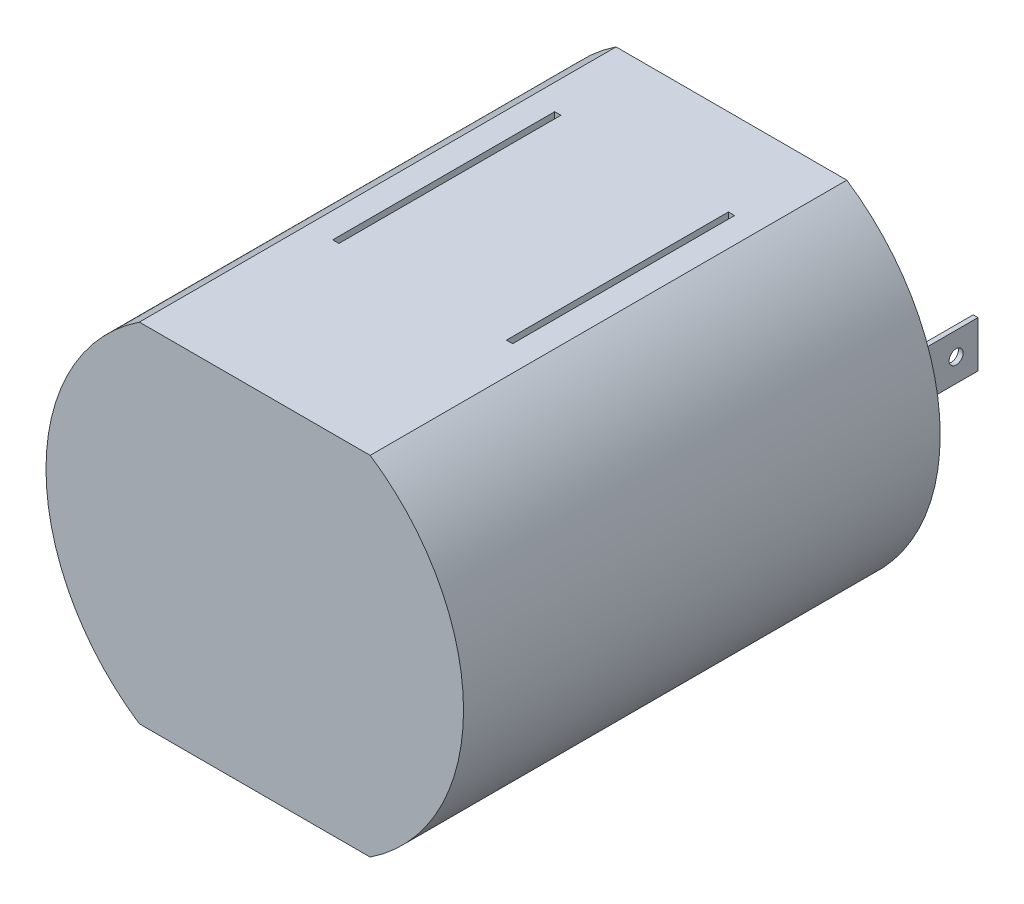
ISO-10303-21;
HEADER;
FILE_DESCRIPTION(('STEP AP214'),'2;1');
FILE_NAME('part.step','',(''),(''),'','','');
FILE_SCHEMA(('AUTOMOTIVE_DESIGN { 1 0 10303 214 1 1 1 1 }'));
ENDSEC;
DATA;
#1=APPLICATION_CONTEXT('core data for automotive mechanical design processes');
#2=APPLICATION_PROTOCOL_DEFINITION('international standard','automotive_design',2000,#1);
#3=PRODUCT_CONTEXT('',#1,'mechanical');
#4=PRODUCT('Part','Part','',(#3));
#5=PRODUCT_RELATED_PRODUCT_CATEGORY('part','',(#4));
#6=PRODUCT_DEFINITION_FORMATION('','',#4);
#7=PRODUCT_DEFINITION_CONTEXT('part definition',#1,'design');
#8=PRODUCT_DEFINITION('design','',#6,#7);
#9=PRODUCT_DEFINITION_SHAPE('','',#8);
#10=(LENGTH_UNIT() NAMED_UNIT(*) SI_UNIT(.MILLI.,.METRE.));
#11=(NAMED_UNIT(*) PLANE_ANGLE_UNIT() SI_UNIT($,.RADIAN.));
#12=(NAMED_UNIT(*) SI_UNIT($,.STERADIAN.) SOLID_ANGLE_UNIT());
#13=UNCERTAINTY_MEASURE_WITH_UNIT(LENGTH_MEASURE(1.E-05),#10,'distance_accuracy_value','');
#14=(GEOMETRIC_REPRESENTATION_CONTEXT(3) GLOBAL_UNCERTAINTY_ASSIGNED_CONTEXT((#13)) GLOBAL_UNIT_ASSIGNED_CONTEXT((#10,
#11,#12)) REPRESENTATION_CONTEXT('',''));
#15=CARTESIAN_POINT('',(0.,0.,0.));
#16=DIRECTION('',(0.,0.,1.));
#17=DIRECTION('',(1.,0.,0.));
#18=AXIS2_PLACEMENT_3D('',#15,#16,#17);
#19=CARTESIAN_POINT('',(0.,0.,0.));
#20=DIRECTION('',(0.,0.,1.));
#21=DIRECTION('',(1.,0.,0.));
#22=AXIS2_PLACEMENT_3D('',#19,#20,#21);
#23=PLANE('',#22);
#24=DIRECTION('',(0.,1.,0.));
#25=VECTOR('',#24,1.);
#26=CARTESIAN_POINT('',(-4.28659431064549,-0.664589732982446,0.));
#27=LINE('',#26,#25);
#28=CARTESIAN_POINT('',(-4.28659431064549,-0.664589732982446,0.));
#29=VERTEX_POINT('',#28);
#30=CARTESIAN_POINT('',(-4.28659431064549,0.664589732982446,0.));
#31=VERTEX_POINT('',#30);
#32=EDGE_CURVE('E193',#29,#31,#27,.T.);
#33=ORIENTED_EDGE('',*,*,#32,.F.);
#34=DIRECTION('',(-1.,0.,0.));
#35=VECTOR('',#34,1.);
#36=CARTESIAN_POINT('',(-4.28659431064549,-0.664589732982446,0.));
#37=LINE('',#36,#35);
#38=CARTESIAN_POINT('',(-4.14845641783212,-0.664589732982446,0.));
#39=VERTEX_POINT('',#38);
#40=EDGE_CURVE('E206',#39,#29,#37,.T.);
#41=ORIENTED_EDGE('',*,*,#40,.F.);
#42=DIRECTION('',(0.,-1.,0.));
#43=VECTOR('',#42,1.);
#44=CARTESIAN_POINT('',(-4.14845641783212,-0.664589732982446,0.));
#45=LINE('',#44,#43);
#46=CARTESIAN_POINT('',(-4.14845641783212,0.664589732982446,0.));
#47=VERTEX_POINT('',#46);
#48=EDGE_CURVE('E215',#47,#39,#45,.T.);
#49=ORIENTED_EDGE('',*,*,#48,.F.);
#50=DIRECTION('',(1.,0.,0.));
#51=VECTOR('',#50,1.);
#52=CARTESIAN_POINT('',(-4.28659431064549,0.664589732982446,0.));
#53=LINE('',#52,#51);
#54=EDGE_CURVE('E196',#31,#47,#53,.T.);
#55=ORIENTED_EDGE('',*,*,#54,.F.);
#56=EDGE_LOOP('',(#33,#41,#49,#55));
#57=FACE_BOUND('',#56,.T.);
#58=CARTESIAN_POINT('',(0.,0.,0.));
#59=DIRECTION('',(0.,0.,1.));
#60=DIRECTION('',(1.,0.,0.));
#61=AXIS2_PLACEMENT_3D('',#58,#59,#60);
#62=CIRCLE('',#61,6.);
#63=CARTESIAN_POINT('',(3.3166247903554,-5.,0.));
#64=VERTEX_POINT('',#63);
#65=CARTESIAN_POINT('',(3.3166247903554,5.,0.));
#66=VERTEX_POINT('',#65);
#67=EDGE_CURVE('E292',#64,#66,#62,.T.);
#68=ORIENTED_EDGE('',*,*,#67,.F.);
#69=DIRECTION('',(1.,0.,0.));
#70=VECTOR('',#69,1.);
#71=CARTESIAN_POINT('',(-3.3166247903554,-5.,0.));
#72=LINE('',#71,#70);
#73=CARTESIAN_POINT('',(-3.3166247903554,-5.,0.));
#74=VERTEX_POINT('',#73);
#75=EDGE_CURVE('E303',#74,#64,#72,.T.);
#76=ORIENTED_EDGE('',*,*,#75,.F.);
#77=CARTESIAN_POINT('',(0.,0.,0.));
#78=DIRECTION('',(0.,0.,1.));
#79=DIRECTION('',(1.,0.,0.));
#80=AXIS2_PLACEMENT_3D('',#77,#78,#79);
#81=CIRCLE('',#80,6.);
#82=CARTESIAN_POINT('',(-3.3166247903554,5.,0.));
#83=VERTEX_POINT('',#82);
#84=EDGE_CURVE('E314',#83,#74,#81,.T.);
#85=ORIENTED_EDGE('',*,*,#84,.F.);
#86=DIRECTION('',(-1.,0.,0.));
#87=VECTOR('',#86,1.);
#88=CARTESIAN_POINT('',(-3.3166247903554,5.,0.));
#89=LINE('',#88,#87);
#90=EDGE_CURVE('E312',#66,#83,#89,.T.);
#91=ORIENTED_EDGE('',*,*,#90,.F.);
#92=EDGE_LOOP('',(#68,#76,#85,#91));
#93=FACE_BOUND('',#92,.T.);
#94=CARTESIAN_POINT('',(0.,0.,0.));
#95=DIRECTION('',(0.,0.,1.));
#96=DIRECTION('',(1.,0.,0.));
#97=AXIS2_PLACEMENT_3D('',#94,#95,#96);
#98=CIRCLE('',#97,0.85);
#99=CARTESIAN_POINT('',(0.85,0.,0.));
#100=VERTEX_POINT('',#99);
#101=EDGE_CURVE('E11',#100,#100,#98,.F.);
#102=ORIENTED_EDGE('',*,*,#101,.F.);
#103=EDGE_LOOP('',(#102));
#104=FACE_BOUND('',#103,.T.);
#105=DIRECTION('',(0.,1.,0.));
#106=VECTOR('',#105,1.);
#107=CARTESIAN_POINT('',(4.14845641783212,-0.664589732982446,0.));
#108=LINE('',#107,#106);
#109=CARTESIAN_POINT('',(4.14845641783212,-0.664589732982446,0.));
#110=VERTEX_POINT('',#109);
#111=CARTESIAN_POINT('',(4.14845641783212,0.664589732982446,0.));
#112=VERTEX_POINT('',#111);
#113=EDGE_CURVE('E192',#110,#112,#108,.T.);
#114=ORIENTED_EDGE('',*,*,#113,.F.);
#115=DIRECTION('',(-1.,0.,0.));
#116=VECTOR('',#115,1.);
#117=CARTESIAN_POINT('',(4.28659431064549,-0.664589732982446,0.));
#118=LINE('',#117,#116);
#119=CARTESIAN_POINT('',(4.28659431064549,-0.664589732982446,0.));
#120=VERTEX_POINT('',#119);
#121=EDGE_CURVE('E189',#120,#110,#118,.T.);
#122=ORIENTED_EDGE('',*,*,#121,.F.);
#123=DIRECTION('',(0.,-1.,0.));
#124=VECTOR('',#123,1.);
#125=CARTESIAN_POINT('',(4.28659431064549,-0.664589732982446,0.));
#126=LINE('',#125,#124);
#127=CARTESIAN_POINT('',(4.28659431064549,0.664589732982446,0.));
#128=VERTEX_POINT('',#127);
#129=EDGE_CURVE('E55',#128,#120,#126,.T.);
#130=ORIENTED_EDGE('',*,*,#129,.F.);
#131=DIRECTION('',(1.,0.,0.));
#132=VECTOR('',#131,1.);
#133=CARTESIAN_POINT('',(4.28659431064549,0.664589732982446,0.));
#134=LINE('',#133,#132);
#135=EDGE_CURVE('E50',#112,#128,#134,.T.);
#136=ORIENTED_EDGE('',*,*,#135,.F.);
#137=EDGE_LOOP('',(#114,#122,#130,#136));
#138=FACE_BOUND('',#137,.T.);
#139=ADVANCED_FACE('F34',(#57,#93,#104,#138),#23,.F.);
#140=CARTESIAN_POINT('',(0.,0.,13.7));
#141=DIRECTION('',(0.,0.,-1.));
#142=DIRECTION('',(-1.,0.,0.));
#143=AXIS2_PLACEMENT_3D('',#140,#141,#142);
#144=CYLINDRICAL_SURFACE('',#143,6.);
#145=ORIENTED_EDGE('',*,*,#67,.T.);
#146=DIRECTION('',(0.,0.,-1.));
#147=VECTOR('',#146,1.);
#148=CARTESIAN_POINT('',(3.3166247903554,5.,13.7));
#149=LINE('',#148,#147);
#150=CARTESIAN_POINT('',(3.3166247903554,5.,13.7));
#151=VERTEX_POINT('',#150);
#152=EDGE_CURVE('E43',#151,#66,#149,.T.);
#153=ORIENTED_EDGE('',*,*,#152,.F.);
#154=CARTESIAN_POINT('',(0.,0.,13.7));
#155=DIRECTION('',(0.,0.,1.));
#156=DIRECTION('',(1.,0.,0.));
#157=AXIS2_PLACEMENT_3D('',#154,#155,#156);
#158=CIRCLE('',#157,6.);
#159=CARTESIAN_POINT('',(3.3166247903554,-5.,13.7));
#160=VERTEX_POINT('',#159);
#161=EDGE_CURVE('E299',#160,#151,#158,.T.);
#162=ORIENTED_EDGE('',*,*,#161,.F.);
#163=DIRECTION('',(0.,0.,-1.));
#164=VECTOR('',#163,1.);
#165=CARTESIAN_POINT('',(3.3166247903554,-5.,13.7));
#166=LINE('',#165,#164);
#167=EDGE_CURVE('E309',#160,#64,#166,.T.);
#168=ORIENTED_EDGE('',*,*,#167,.T.);
#169=EDGE_LOOP('',(#145,#153,#162,#168));
#170=FACE_BOUND('',#169,.T.);
#171=ADVANCED_FACE('F36',(#170),#144,.T.);
#172=CARTESIAN_POINT('',(-3.3166247903554,5.,13.7));
#173=DIRECTION('',(0.,-1.,0.));
#174=DIRECTION('',(0.,0.,-1.));
#175=AXIS2_PLACEMENT_3D('',#172,#173,#174);
#176=PLANE('',#175);
#177=DIRECTION('',(-1.,0.,0.));
#178=VECTOR('',#177,1.);
#179=CARTESIAN_POINT('',(2.58524337144905,5.,2.49401252835213));
#180=LINE('',#179,#178);
#181=CARTESIAN_POINT('',(2.58524337144905,5.,2.49401252835213));
#182=VERTEX_POINT('',#181);
#183=CARTESIAN_POINT('',(2.40667169885356,5.,2.49401252835213));
#184=VERTEX_POINT('',#183);
#185=EDGE_CURVE('E250',#182,#184,#180,.T.);
#186=ORIENTED_EDGE('',*,*,#185,.F.);
#187=DIRECTION('',(0.,0.,-1.));
#188=VECTOR('',#187,1.);
#189=CARTESIAN_POINT('',(2.58524337144905,5.,2.49401252835213));
#190=LINE('',#189,#188);
#191=CARTESIAN_POINT('',(2.58524337144905,5.,8.87492962219482));
#192=VERTEX_POINT('',#191);
#193=EDGE_CURVE('E234',#192,#182,#190,.T.);
#194=ORIENTED_EDGE('',*,*,#193,.F.);
#195=DIRECTION('',(1.,0.,0.));
#196=VECTOR('',#195,1.);
#197=CARTESIAN_POINT('',(2.58524337144905,5.,8.87492962219482));
#198=LINE('',#197,#196);
#199=CARTESIAN_POINT('',(2.40667169885356,5.,8.87492962219482));
#200=VERTEX_POINT('',#199);
#201=EDGE_CURVE('E239',#200,#192,#198,.T.);
#202=ORIENTED_EDGE('',*,*,#201,.F.);
#203=DIRECTION('',(0.,0.,1.));
#204=VECTOR('',#203,1.);
#205=CARTESIAN_POINT('',(2.40667169885356,5.,2.49401252835213));
#206=LINE('',#205,#204);
#207=EDGE_CURVE('E253',#184,#200,#206,.T.);
#208=ORIENTED_EDGE('',*,*,#207,.F.);
#209=EDGE_LOOP('',(#186,#194,#202,#208));
#210=FACE_BOUND('',#209,.T.);
#211=DIRECTION('',(1.,0.,0.));
#212=VECTOR('',#211,1.);
#213=CARTESIAN_POINT('',(-2.40667169885356,5.,8.87492962219483));
#214=LINE('',#213,#212);
#215=CARTESIAN_POINT('',(-2.58524337144905,5.,8.87492962219482));
#216=VERTEX_POINT('',#215);
#217=CARTESIAN_POINT('',(-2.40667169885356,5.,8.87492962219483));
#218=VERTEX_POINT('',#217);
#219=EDGE_CURVE('E282',#216,#218,#214,.T.);
#220=ORIENTED_EDGE('',*,*,#219,.F.);
#221=DIRECTION('',(0.,0.,1.));
#222=VECTOR('',#221,1.);
#223=CARTESIAN_POINT('',(-2.58524337144905,5.,2.49401252835213));
#224=LINE('',#223,#222);
#225=CARTESIAN_POINT('',(-2.58524337144905,5.,2.49401252835213));
#226=VERTEX_POINT('',#225);
#227=EDGE_CURVE('E260',#226,#216,#224,.T.);
#228=ORIENTED_EDGE('',*,*,#227,.F.);
#229=DIRECTION('',(-1.,0.,0.));
#230=VECTOR('',#229,1.);
#231=CARTESIAN_POINT('',(-2.40667169885356,5.,2.49401252835213));
#232=LINE('',#231,#230);
#233=CARTESIAN_POINT('',(-2.40667169885356,5.,2.49401252835213));
#234=VERTEX_POINT('',#233);
#235=EDGE_CURVE('E271',#234,#226,#232,.T.);
#236=ORIENTED_EDGE('',*,*,#235,.F.);
#237=DIRECTION('',(0.,0.,-1.));
#238=VECTOR('',#237,1.);
#239=CARTESIAN_POINT('',(-2.40667169885356,5.,2.49401252835213));
#240=LINE('',#239,#238);
#241=EDGE_CURVE('E285',#218,#234,#240,.T.);
#242=ORIENTED_EDGE('',*,*,#241,.F.);
#243=EDGE_LOOP('',(#220,#228,#236,#242));
#244=FACE_BOUND('',#243,.T.);
#245=ORIENTED_EDGE('',*,*,#90,.T.);
#246=DIRECTION('',(0.,0.,-1.));
#247=VECTOR('',#246,1.);
#248=CARTESIAN_POINT('',(-3.3166247903554,5.,13.7));
#249=LINE('',#248,#247);
#250=CARTESIAN_POINT('',(-3.3166247903554,5.,13.7));
#251=VERTEX_POINT('',#250);
#252=EDGE_CURVE('E322',#251,#83,#249,.T.);
#253=ORIENTED_EDGE('',*,*,#252,.F.);
#254=DIRECTION('',(-1.,0.,0.));
#255=VECTOR('',#254,1.);
#256=CARTESIAN_POINT('',(-3.3166247903554,5.,13.7));
#257=LINE('',#256,#255);
#258=EDGE_CURVE('E302',#151,#251,#257,.T.);
#259=ORIENTED_EDGE('',*,*,#258,.F.);
#260=ORIENTED_EDGE('',*,*,#152,.T.);
#261=EDGE_LOOP('',(#245,#253,#259,#260));
#262=FACE_BOUND('',#261,.T.);
#263=ADVANCED_FACE('F328',(#210,#244,#262),#176,.F.);
#264=CARTESIAN_POINT('',(0.,0.,13.7));
#265=DIRECTION('',(0.,0.,-1.));
#266=DIRECTION('',(-1.,0.,0.));
#267=AXIS2_PLACEMENT_3D('',#264,#265,#266);
#268=CYLINDRICAL_SURFACE('',#267,6.);
#269=ORIENTED_EDGE('',*,*,#84,.T.);
#270=DIRECTION('',(0.,0.,-1.));
#271=VECTOR('',#270,1.);
#272=CARTESIAN_POINT('',(-3.3166247903554,-5.,13.7));
#273=LINE('',#272,#271);
#274=CARTESIAN_POINT('',(-3.3166247903554,-5.,13.7));
#275=VERTEX_POINT('',#274);
#276=EDGE_CURVE('E319',#275,#74,#273,.T.);
#277=ORIENTED_EDGE('',*,*,#276,.F.);
#278=CARTESIAN_POINT('',(0.,0.,13.7));
#279=DIRECTION('',(0.,0.,1.));
#280=DIRECTION('',(1.,0.,0.));
#281=AXIS2_PLACEMENT_3D('',#278,#279,#280);
#282=CIRCLE('',#281,6.);
#283=EDGE_CURVE('E305',#251,#275,#282,.T.);
#284=ORIENTED_EDGE('',*,*,#283,.F.);
#285=ORIENTED_EDGE('',*,*,#252,.T.);
#286=EDGE_LOOP('',(#269,#277,#284,#285));
#287=FACE_BOUND('',#286,.T.);
#288=ADVANCED_FACE('F340',(#287),#268,.T.);
#289=CARTESIAN_POINT('',(-3.3166247903554,-5.,13.7));
#290=DIRECTION('',(0.,1.,0.));
#291=DIRECTION('',(-1.,0.,0.));
#292=AXIS2_PLACEMENT_3D('',#289,#290,#291);
#293=PLANE('',#292);
#294=ORIENTED_EDGE('',*,*,#75,.T.);
#295=ORIENTED_EDGE('',*,*,#167,.F.);
#296=DIRECTION('',(1.,0.,0.));
#297=VECTOR('',#296,1.);
#298=CARTESIAN_POINT('',(-3.3166247903554,-5.,13.7));
#299=LINE('',#298,#297);
#300=EDGE_CURVE('E307',#275,#160,#299,.T.);
#301=ORIENTED_EDGE('',*,*,#300,.F.);
#302=ORIENTED_EDGE('',*,*,#276,.T.);
#303=EDGE_LOOP('',(#294,#295,#301,#302));
#304=FACE_BOUND('',#303,.T.);
#305=ADVANCED_FACE('F344',(#304),#293,.F.);
#306=CARTESIAN_POINT('',(0.,0.,13.7));
#307=DIRECTION('',(0.,0.,1.));
#308=DIRECTION('',(1.,0.,0.));
#309=AXIS2_PLACEMENT_3D('',#306,#307,#308);
#310=PLANE('',#309);
#311=ORIENTED_EDGE('',*,*,#161,.T.);
#312=ORIENTED_EDGE('',*,*,#258,.T.);
#313=ORIENTED_EDGE('',*,*,#283,.T.);
#314=ORIENTED_EDGE('',*,*,#300,.T.);
#315=EDGE_LOOP('',(#311,#312,#313,#314));
#316=FACE_BOUND('',#315,.T.);
#317=ADVANCED_FACE('F346',(#316),#310,.T.);
#318=CARTESIAN_POINT('',(-2.58524337144905,4.8,2.49401252835213));
#319=DIRECTION('',(-1.,0.,0.));
#320=DIRECTION('',(0.,0.,1.));
#321=AXIS2_PLACEMENT_3D('',#318,#319,#320);
#322=PLANE('',#321);
#323=ORIENTED_EDGE('',*,*,#227,.T.);
#324=DIRECTION('',(0.,1.,0.));
#325=VECTOR('',#324,1.);
#326=CARTESIAN_POINT('',(-2.58524337144905,4.8,8.87492962219482));
#327=LINE('',#326,#325);
#328=CARTESIAN_POINT('',(-2.58524337144905,4.8,8.87492962219482));
#329=VERTEX_POINT('',#328);
#330=EDGE_CURVE('E280',#329,#216,#327,.T.);
#331=ORIENTED_EDGE('',*,*,#330,.F.);
#332=DIRECTION('',(0.,0.,1.));
#333=VECTOR('',#332,1.);
#334=CARTESIAN_POINT('',(-2.58524337144905,4.8,2.49401252835213));
#335=LINE('',#334,#333);
#336=CARTESIAN_POINT('',(-2.58524337144905,4.8,2.49401252835213));
#337=VERTEX_POINT('',#336);
#338=EDGE_CURVE('E267',#337,#329,#335,.T.);
#339=ORIENTED_EDGE('',*,*,#338,.F.);
#340=DIRECTION('',(0.,1.,0.));
#341=VECTOR('',#340,1.);
#342=CARTESIAN_POINT('',(-2.58524337144905,4.8,2.49401252835213));
#343=LINE('',#342,#341);
#344=EDGE_CURVE('E290',#337,#226,#343,.T.);
#345=ORIENTED_EDGE('',*,*,#344,.T.);
#346=EDGE_LOOP('',(#323,#331,#339,#345));
#347=FACE_BOUND('',#346,.T.);
#348=ADVANCED_FACE('F348',(#347),#322,.F.);
#349=CARTESIAN_POINT('',(-2.40667169885356,4.8,2.49401252835213));
#350=DIRECTION('',(0.,0.,-1.));
#351=DIRECTION('',(-1.,0.,0.));
#352=AXIS2_PLACEMENT_3D('',#349,#350,#351);
#353=PLANE('',#352);
#354=ORIENTED_EDGE('',*,*,#235,.T.);
#355=ORIENTED_EDGE('',*,*,#344,.F.);
#356=DIRECTION('',(-1.,0.,0.));
#357=VECTOR('',#356,1.);
#358=CARTESIAN_POINT('',(-2.40667169885356,4.8,2.49401252835213));
#359=LINE('',#358,#357);
#360=CARTESIAN_POINT('',(-2.40667169885356,4.8,2.49401252835213));
#361=VERTEX_POINT('',#360);
#362=EDGE_CURVE('E277',#361,#337,#359,.T.);
#363=ORIENTED_EDGE('',*,*,#362,.F.);
#364=DIRECTION('',(0.,1.,0.));
#365=VECTOR('',#364,1.);
#366=CARTESIAN_POINT('',(-2.40667169885356,4.8,2.49401252835213));
#367=LINE('',#366,#365);
#368=EDGE_CURVE('E293',#361,#234,#367,.T.);
#369=ORIENTED_EDGE('',*,*,#368,.T.);
#370=EDGE_LOOP('',(#354,#355,#363,#369));
#371=FACE_BOUND('',#370,.T.);
#372=ADVANCED_FACE('F354',(#371),#353,.F.);
#373=CARTESIAN_POINT('',(-2.40667169885356,4.8,2.49401252835213));
#374=DIRECTION('',(1.,0.,0.));
#375=DIRECTION('',(0.,0.,-1.));
#376=AXIS2_PLACEMENT_3D('',#373,#374,#375);
#377=PLANE('',#376);
#378=ORIENTED_EDGE('',*,*,#241,.T.);
#379=ORIENTED_EDGE('',*,*,#368,.F.);
#380=DIRECTION('',(0.,0.,-1.));
#381=VECTOR('',#380,1.);
#382=CARTESIAN_POINT('',(-2.40667169885356,4.8,2.49401252835213));
#383=LINE('',#382,#381);
#384=CARTESIAN_POINT('',(-2.40667169885356,4.8,8.87492962219483));
#385=VERTEX_POINT('',#384);
#386=EDGE_CURVE('E274',#385,#361,#383,.T.);
#387=ORIENTED_EDGE('',*,*,#386,.F.);
#388=DIRECTION('',(0.,1.,0.));
#389=VECTOR('',#388,1.);
#390=CARTESIAN_POINT('',(-2.40667169885356,4.8,8.87492962219483));
#391=LINE('',#390,#389);
#392=EDGE_CURVE('E295',#385,#218,#391,.T.);
#393=ORIENTED_EDGE('',*,*,#392,.T.);
#394=EDGE_LOOP('',(#378,#379,#387,#393));
#395=FACE_BOUND('',#394,.T.);
#396=ADVANCED_FACE('F386',(#395),#377,.F.);
#397=CARTESIAN_POINT('',(-2.40667169885356,4.8,8.87492962219483));
#398=DIRECTION('',(0.,0.,1.));
#399=DIRECTION('',(1.,0.,0.));
#400=AXIS2_PLACEMENT_3D('',#397,#398,#399);
#401=PLANE('',#400);
#402=ORIENTED_EDGE('',*,*,#219,.T.);
#403=ORIENTED_EDGE('',*,*,#392,.F.);
#404=DIRECTION('',(1.,0.,0.));
#405=VECTOR('',#404,1.);
#406=CARTESIAN_POINT('',(-2.40667169885356,4.8,8.87492962219483));
#407=LINE('',#406,#405);
#408=EDGE_CURVE('E270',#329,#385,#407,.T.);
#409=ORIENTED_EDGE('',*,*,#408,.F.);
#410=ORIENTED_EDGE('',*,*,#330,.T.);
#411=EDGE_LOOP('',(#402,#403,#409,#410));
#412=FACE_BOUND('',#411,.T.);
#413=ADVANCED_FACE('F379',(#412),#401,.F.);
#414=CARTESIAN_POINT('',(0.,4.8,0.));
#415=DIRECTION('',(0.,-1.,0.));
#416=DIRECTION('',(0.,0.,-1.));
#417=AXIS2_PLACEMENT_3D('',#414,#415,#416);
#418=PLANE('',#417);
#419=ORIENTED_EDGE('',*,*,#338,.T.);
#420=ORIENTED_EDGE('',*,*,#408,.T.);
#421=ORIENTED_EDGE('',*,*,#386,.T.);
#422=ORIENTED_EDGE('',*,*,#362,.T.);
#423=EDGE_LOOP('',(#419,#420,#421,#422));
#424=FACE_BOUND('',#423,.T.);
#425=ADVANCED_FACE('F388',(#424),#418,.F.);
#426=CARTESIAN_POINT('',(2.58524337144905,4.8,2.49401252835213));
#427=DIRECTION('',(1.,0.,0.));
#428=DIRECTION('',(0.,0.,-1.));
#429=AXIS2_PLACEMENT_3D('',#426,#427,#428);
#430=PLANE('',#429);
#431=ORIENTED_EDGE('',*,*,#193,.T.);
#432=DIRECTION('',(0.,1.,0.));
#433=VECTOR('',#432,1.);
#434=CARTESIAN_POINT('',(2.58524337144905,4.8,2.49401252835213));
#435=LINE('',#434,#433);
#436=CARTESIAN_POINT('',(2.58524337144905,4.8,2.49401252835213));
#437=VERTEX_POINT('',#436);
#438=EDGE_CURVE('E248',#437,#182,#435,.T.);
#439=ORIENTED_EDGE('',*,*,#438,.F.);
#440=DIRECTION('',(0.,0.,-1.));
#441=VECTOR('',#440,1.);
#442=CARTESIAN_POINT('',(2.58524337144905,4.8,2.49401252835213));
#443=LINE('',#442,#441);
#444=CARTESIAN_POINT('',(2.58524337144905,4.8,8.87492962219482));
#445=VERTEX_POINT('',#444);
#446=EDGE_CURVE('E235',#445,#437,#443,.T.);
#447=ORIENTED_EDGE('',*,*,#446,.F.);
#448=DIRECTION('',(0.,1.,0.));
#449=VECTOR('',#448,1.);
#450=CARTESIAN_POINT('',(2.58524337144905,4.8,8.87492962219482));
#451=LINE('',#450,#449);
#452=EDGE_CURVE('E258',#445,#192,#451,.T.);
#453=ORIENTED_EDGE('',*,*,#452,.T.);
#454=EDGE_LOOP('',(#431,#439,#447,#453));
#455=FACE_BOUND('',#454,.T.);
#456=ADVANCED_FACE('F390',(#455),#430,.F.);
#457=CARTESIAN_POINT('',(2.58524337144905,4.8,8.87492962219482));
#458=DIRECTION('',(0.,0.,1.));
#459=DIRECTION('',(1.,0.,0.));
#460=AXIS2_PLACEMENT_3D('',#457,#458,#459);
#461=PLANE('',#460);
#462=ORIENTED_EDGE('',*,*,#201,.T.);
#463=ORIENTED_EDGE('',*,*,#452,.F.);
#464=DIRECTION('',(1.,0.,0.));
#465=VECTOR('',#464,1.);
#466=CARTESIAN_POINT('',(2.58524337144905,4.8,8.87492962219482));
#467=LINE('',#466,#465);
#468=CARTESIAN_POINT('',(2.40667169885356,4.8,8.87492962219482));
#469=VERTEX_POINT('',#468);
#470=EDGE_CURVE('E245',#469,#445,#467,.T.);
#471=ORIENTED_EDGE('',*,*,#470,.F.);
#472=DIRECTION('',(0.,1.,0.));
#473=VECTOR('',#472,1.);
#474=CARTESIAN_POINT('',(2.40667169885356,4.8,8.87492962219482));
#475=LINE('',#474,#473);
#476=EDGE_CURVE('E261',#469,#200,#475,.T.);
#477=ORIENTED_EDGE('',*,*,#476,.T.);
#478=EDGE_LOOP('',(#462,#463,#471,#477));
#479=FACE_BOUND('',#478,.T.);
#480=ADVANCED_FACE('F396',(#479),#461,.F.);
#481=CARTESIAN_POINT('',(2.40667169885356,4.8,2.49401252835213));
#482=DIRECTION('',(-1.,0.,0.));
#483=DIRECTION('',(0.,0.,1.));
#484=AXIS2_PLACEMENT_3D('',#481,#482,#483);
#485=PLANE('',#484);
#486=ORIENTED_EDGE('',*,*,#207,.T.);
#487=ORIENTED_EDGE('',*,*,#476,.F.);
#488=DIRECTION('',(0.,0.,1.));
#489=VECTOR('',#488,1.);
#490=CARTESIAN_POINT('',(2.40667169885356,4.8,2.49401252835213));
#491=LINE('',#490,#489);
#492=CARTESIAN_POINT('',(2.40667169885356,4.8,2.49401252835213));
#493=VERTEX_POINT('',#492);
#494=EDGE_CURVE('E242',#493,#469,#491,.T.);
#495=ORIENTED_EDGE('',*,*,#494,.F.);
#496=DIRECTION('',(0.,1.,0.));
#497=VECTOR('',#496,1.);
#498=CARTESIAN_POINT('',(2.40667169885356,4.8,2.49401252835213));
#499=LINE('',#498,#497);
#500=EDGE_CURVE('E263',#493,#184,#499,.T.);
#501=ORIENTED_EDGE('',*,*,#500,.T.);
#502=EDGE_LOOP('',(#486,#487,#495,#501));
#503=FACE_BOUND('',#502,.T.);
#504=ADVANCED_FACE('F432',(#503),#485,.F.);
#505=CARTESIAN_POINT('',(2.58524337144905,4.8,2.49401252835213));
#506=DIRECTION('',(0.,0.,-1.));
#507=DIRECTION('',(-1.,0.,0.));
#508=AXIS2_PLACEMENT_3D('',#505,#506,#507);
#509=PLANE('',#508);
#510=ORIENTED_EDGE('',*,*,#185,.T.);
#511=ORIENTED_EDGE('',*,*,#500,.F.);
#512=DIRECTION('',(-1.,0.,0.));
#513=VECTOR('',#512,1.);
#514=CARTESIAN_POINT('',(2.58524337144905,4.8,2.49401252835213));
#515=LINE('',#514,#513);
#516=EDGE_CURVE('E238',#437,#493,#515,.T.);
#517=ORIENTED_EDGE('',*,*,#516,.F.);
#518=ORIENTED_EDGE('',*,*,#438,.T.);
#519=EDGE_LOOP('',(#510,#511,#517,#518));
#520=FACE_BOUND('',#519,.T.);
#521=ADVANCED_FACE('F442',(#520),#509,.F.);
#522=CARTESIAN_POINT('',(0.,4.8,0.));
#523=DIRECTION('',(0.,-1.,0.));
#524=DIRECTION('',(0.,0.,-1.));
#525=AXIS2_PLACEMENT_3D('',#522,#523,#524);
#526=PLANE('',#525);
#527=ORIENTED_EDGE('',*,*,#446,.T.);
#528=ORIENTED_EDGE('',*,*,#516,.T.);
#529=ORIENTED_EDGE('',*,*,#494,.T.);
#530=ORIENTED_EDGE('',*,*,#470,.T.);
#531=EDGE_LOOP('',(#527,#528,#529,#530));
#532=FACE_BOUND('',#531,.T.);
#533=ADVANCED_FACE('F452',(#532),#526,.F.);
#534=CARTESIAN_POINT('',(0.,0.,-1.8));
#535=DIRECTION('',(0.,0.,1.));
#536=DIRECTION('',(1.,0.,0.));
#537=AXIS2_PLACEMENT_3D('',#534,#535,#536);
#538=CYLINDRICAL_SURFACE('',#537,0.85);
#539=CARTESIAN_POINT('',(0.,0.,-1.8));
#540=DIRECTION('',(0.,0.,-1.));
#541=DIRECTION('',(-1.,0.,0.));
#542=AXIS2_PLACEMENT_3D('',#539,#540,#541);
#543=CIRCLE('',#542,0.85);
#544=CARTESIAN_POINT('',(-0.85,0.,-1.8));
#545=VERTEX_POINT('',#544);
#546=EDGE_CURVE('E231',#545,#545,#543,.T.);
#547=ORIENTED_EDGE('',*,*,#546,.F.);
#548=EDGE_LOOP('',(#547));
#549=FACE_BOUND('',#548,.T.);
#550=ORIENTED_EDGE('',*,*,#101,.T.);
#551=EDGE_LOOP('',(#550));
#552=FACE_BOUND('',#551,.T.);
#553=ADVANCED_FACE('F461',(#549,#552),#538,.T.);
#554=CARTESIAN_POINT('',(0.,0.,-1.8));
#555=DIRECTION('',(0.,0.,-1.));
#556=DIRECTION('',(-1.,0.,0.));
#557=AXIS2_PLACEMENT_3D('',#554,#555,#556);
#558=PLANE('',#557);
#559=ORIENTED_EDGE('',*,*,#546,.T.);
#560=EDGE_LOOP('',(#559));
#561=FACE_BOUND('',#560,.T.);
#562=ADVANCED_FACE('F471',(#561),#558,.T.);
#563=CARTESIAN_POINT('',(-4.28659431064549,-0.664589732982446,-2.8));
#564=DIRECTION('',(1.,0.,0.));
#565=DIRECTION('',(0.,0.,-1.));
#566=AXIS2_PLACEMENT_3D('',#563,#564,#565);
#567=PLANE('',#566);
#568=CARTESIAN_POINT('',(-4.28659431064549,0.,-2.17165069805757));
#569=DIRECTION('',(-1.,0.,0.));
#570=DIRECTION('',(0.,0.,1.));
#571=AXIS2_PLACEMENT_3D('',#568,#569,#570);
#572=CIRCLE('',#571,0.201984570490971);
#573=CARTESIAN_POINT('',(-4.28659431064549,0.,-1.9696661275666));
#574=VERTEX_POINT('',#573);
#575=EDGE_CURVE('E619',#574,#574,#572,.T.);
#576=ORIENTED_EDGE('',*,*,#575,.F.);
#577=EDGE_LOOP('',(#576));
#578=FACE_BOUND('',#577,.T.);
#579=ORIENTED_EDGE('',*,*,#32,.T.);
#580=DIRECTION('',(0.,0.,1.));
#581=VECTOR('',#580,1.);
#582=CARTESIAN_POINT('',(-4.28659431064549,0.664589732982446,-2.8));
#583=LINE('',#582,#581);
#584=CARTESIAN_POINT('',(-4.28659431064549,0.664589732982446,-2.8));
#585=VERTEX_POINT('',#584);
#586=EDGE_CURVE('E228',#585,#31,#583,.T.);
#587=ORIENTED_EDGE('',*,*,#586,.F.);
#588=DIRECTION('',(0.,1.,0.));
#589=VECTOR('',#588,1.);
#590=CARTESIAN_POINT('',(-4.28659431064549,-0.664589732982446,-2.8));
#591=LINE('',#590,#589);
#592=CARTESIAN_POINT('',(-4.28659431064549,-0.664589732982446,-2.8));
#593=VERTEX_POINT('',#592);
#594=EDGE_CURVE('E202',#593,#585,#591,.T.);
#595=ORIENTED_EDGE('',*,*,#594,.F.);
#596=DIRECTION('',(0.,0.,1.));
#597=VECTOR('',#596,1.);
#598=CARTESIAN_POINT('',(-4.28659431064549,-0.664589732982446,-2.8));
#599=LINE('',#598,#597);
#600=EDGE_CURVE('E211',#593,#29,#599,.T.);
#601=ORIENTED_EDGE('',*,*,#600,.T.);
#602=EDGE_LOOP('',(#579,#587,#595,#601));
#603=FACE_BOUND('',#602,.T.);
#604=ADVANCED_FACE('F482',(#578,#603),#567,.F.);
#605=CARTESIAN_POINT('',(-4.28659431064549,0.664589732982446,-2.8));
#606=DIRECTION('',(0.,-1.,0.));
#607=DIRECTION('',(0.,0.,-1.));
#608=AXIS2_PLACEMENT_3D('',#605,#606,#607);
#609=PLANE('',#608);
#610=ORIENTED_EDGE('',*,*,#54,.T.);
#611=DIRECTION('',(0.,0.,1.));
#612=VECTOR('',#611,1.);
#613=CARTESIAN_POINT('',(-4.14845641783212,0.664589732982446,-2.8));
#614=LINE('',#613,#612);
#615=CARTESIAN_POINT('',(-4.14845641783212,0.664589732982446,-2.8));
#616=VERTEX_POINT('',#615);
#617=EDGE_CURVE('E225',#616,#47,#614,.T.);
#618=ORIENTED_EDGE('',*,*,#617,.F.);
#619=DIRECTION('',(1.,0.,0.));
#620=VECTOR('',#619,1.);
#621=CARTESIAN_POINT('',(-4.28659431064549,0.664589732982446,-2.8));
#622=LINE('',#621,#620);
#623=EDGE_CURVE('E205',#585,#616,#622,.T.);
#624=ORIENTED_EDGE('',*,*,#623,.F.);
#625=ORIENTED_EDGE('',*,*,#586,.T.);
#626=EDGE_LOOP('',(#610,#618,#624,#625));
#627=FACE_BOUND('',#626,.T.);
#628=ADVANCED_FACE('F496',(#627),#609,.F.);
#629=CARTESIAN_POINT('',(-4.14845641783212,-0.664589732982446,-2.8));
#630=DIRECTION('',(-1.,0.,0.));
#631=DIRECTION('',(0.,0.,1.));
#632=AXIS2_PLACEMENT_3D('',#629,#630,#631);
#633=PLANE('',#632);
#634=CARTESIAN_POINT('',(-4.14845641783212,0.,-2.17165069805757));
#635=DIRECTION('',(-1.,0.,0.));
#636=DIRECTION('',(0.,0.,1.));
#637=AXIS2_PLACEMENT_3D('',#634,#635,#636);
#638=CIRCLE('',#637,0.201984570490971);
#639=CARTESIAN_POINT('',(-4.14845641783212,0.,-1.9696661275666));
#640=VERTEX_POINT('',#639);
#641=EDGE_CURVE('E622',#640,#640,#638,.T.);
#642=ORIENTED_EDGE('',*,*,#641,.T.);
#643=EDGE_LOOP('',(#642));
#644=FACE_BOUND('',#643,.T.);
#645=ORIENTED_EDGE('',*,*,#48,.T.);
#646=DIRECTION('',(0.,0.,1.));
#647=VECTOR('',#646,1.);
#648=CARTESIAN_POINT('',(-4.14845641783212,-0.664589732982446,-2.8));
#649=LINE('',#648,#647);
#650=CARTESIAN_POINT('',(-4.14845641783212,-0.664589732982446,-2.8));
#651=VERTEX_POINT('',#650);
#652=EDGE_CURVE('E222',#651,#39,#649,.T.);
#653=ORIENTED_EDGE('',*,*,#652,.F.);
#654=DIRECTION('',(0.,-1.,0.));
#655=VECTOR('',#654,1.);
#656=CARTESIAN_POINT('',(-4.14845641783212,-0.664589732982446,-2.8));
#657=LINE('',#656,#655);
#658=EDGE_CURVE('E208',#616,#651,#657,.T.);
#659=ORIENTED_EDGE('',*,*,#658,.F.);
#660=ORIENTED_EDGE('',*,*,#617,.T.);
#661=EDGE_LOOP('',(#645,#653,#659,#660));
#662=FACE_BOUND('',#661,.T.);
#663=ADVANCED_FACE('F502',(#644,#662),#633,.F.);
#664=CARTESIAN_POINT('',(-4.28659431064549,-0.664589732982446,-2.8));
#665=DIRECTION('',(0.,1.,0.));
#666=DIRECTION('',(0.,0.,1.));
#667=AXIS2_PLACEMENT_3D('',#664,#665,#666);
#668=PLANE('',#667);
#669=ORIENTED_EDGE('',*,*,#40,.T.);
#670=ORIENTED_EDGE('',*,*,#600,.F.);
#671=DIRECTION('',(-1.,0.,0.));
#672=VECTOR('',#671,1.);
#673=CARTESIAN_POINT('',(-4.28659431064549,-0.664589732982446,-2.8));
#674=LINE('',#673,#672);
#675=EDGE_CURVE('E210',#651,#593,#674,.T.);
#676=ORIENTED_EDGE('',*,*,#675,.F.);
#677=ORIENTED_EDGE('',*,*,#652,.T.);
#678=EDGE_LOOP('',(#669,#670,#676,#677));
#679=FACE_BOUND('',#678,.T.);
#680=ADVANCED_FACE('F511',(#679),#668,.F.);
#681=CARTESIAN_POINT('',(0.,0.,-2.8));
#682=DIRECTION('',(0.,0.,-1.));
#683=DIRECTION('',(-1.,0.,0.));
#684=AXIS2_PLACEMENT_3D('',#681,#682,#683);
#685=PLANE('',#684);
#686=ORIENTED_EDGE('',*,*,#594,.T.);
#687=ORIENTED_EDGE('',*,*,#623,.T.);
#688=ORIENTED_EDGE('',*,*,#658,.T.);
#689=ORIENTED_EDGE('',*,*,#675,.T.);
#690=EDGE_LOOP('',(#686,#687,#688,#689));
#691=FACE_BOUND('',#690,.T.);
#692=ADVANCED_FACE('F517',(#691),#685,.T.);
#693=CARTESIAN_POINT('',(4.14845641783212,-0.664589732982446,-2.8));
#694=DIRECTION('',(1.,0.,0.));
#695=DIRECTION('',(0.,0.,-1.));
#696=AXIS2_PLACEMENT_3D('',#693,#694,#695);
#697=PLANE('',#696);
#698=CARTESIAN_POINT('',(4.14845641783212,0.,-2.17165069805757));
#699=DIRECTION('',(1.,0.,0.));
#700=DIRECTION('',(0.,0.,-1.));
#701=AXIS2_PLACEMENT_3D('',#698,#699,#700);
#702=CIRCLE('',#701,0.201984570490971);
#703=CARTESIAN_POINT('',(4.14845641783212,0.,-2.37363526854854));
#704=VERTEX_POINT('',#703);
#705=EDGE_CURVE('E623',#704,#704,#702,.T.);
#706=ORIENTED_EDGE('',*,*,#705,.T.);
#707=EDGE_LOOP('',(#706));
#708=FACE_BOUND('',#707,.T.);
#709=ORIENTED_EDGE('',*,*,#113,.T.);
#710=DIRECTION('',(0.,0.,1.));
#711=VECTOR('',#710,1.);
#712=CARTESIAN_POINT('',(4.14845641783212,0.664589732982446,-2.8));
#713=LINE('',#712,#711);
#714=CARTESIAN_POINT('',(4.14845641783212,0.664589732982446,-2.8));
#715=VERTEX_POINT('',#714);
#716=EDGE_CURVE('E173',#715,#112,#713,.T.);
#717=ORIENTED_EDGE('',*,*,#716,.F.);
#718=DIRECTION('',(0.,1.,0.));
#719=VECTOR('',#718,1.);
#720=CARTESIAN_POINT('',(4.14845641783212,-0.664589732982446,-2.8));
#721=LINE('',#720,#719);
#722=CARTESIAN_POINT('',(4.14845641783212,-0.664589732982446,-2.8));
#723=VERTEX_POINT('',#722);
#724=EDGE_CURVE('E180',#723,#715,#721,.T.);
#725=ORIENTED_EDGE('',*,*,#724,.F.);
#726=DIRECTION('',(0.,0.,1.));
#727=VECTOR('',#726,1.);
#728=CARTESIAN_POINT('',(4.14845641783212,-0.664589732982446,-2.8));
#729=LINE('',#728,#727);
#730=EDGE_CURVE('E631',#723,#110,#729,.T.);
#731=ORIENTED_EDGE('',*,*,#730,.T.);
#732=EDGE_LOOP('',(#709,#717,#725,#731));
#733=FACE_BOUND('',#732,.T.);
#734=ADVANCED_FACE('F191',(#708,#733),#697,.F.);
#735=CARTESIAN_POINT('',(4.28659431064549,0.664589732982446,-2.8));
#736=DIRECTION('',(0.,-1.,0.));
#737=DIRECTION('',(0.,0.,-1.));
#738=AXIS2_PLACEMENT_3D('',#735,#736,#737);
#739=PLANE('',#738);
#740=ORIENTED_EDGE('',*,*,#135,.T.);
#741=DIRECTION('',(0.,0.,1.));
#742=VECTOR('',#741,1.);
#743=CARTESIAN_POINT('',(4.28659431064549,0.664589732982446,-2.8));
#744=LINE('',#743,#742);
#745=CARTESIAN_POINT('',(4.28659431064549,0.664589732982446,-2.8));
#746=VERTEX_POINT('',#745);
#747=EDGE_CURVE('E176',#746,#128,#744,.T.);
#748=ORIENTED_EDGE('',*,*,#747,.F.);
#749=DIRECTION('',(1.,0.,0.));
#750=VECTOR('',#749,1.);
#751=CARTESIAN_POINT('',(4.28659431064549,0.664589732982446,-2.8));
#752=LINE('',#751,#750);
#753=EDGE_CURVE('E169',#715,#746,#752,.T.);
#754=ORIENTED_EDGE('',*,*,#753,.F.);
#755=ORIENTED_EDGE('',*,*,#716,.T.);
#756=EDGE_LOOP('',(#740,#748,#754,#755));
#757=FACE_BOUND('',#756,.T.);
#758=ADVANCED_FACE('F171',(#757),#739,.F.);
#759=CARTESIAN_POINT('',(4.28659431064549,-0.664589732982446,-2.8));
#760=DIRECTION('',(-1.,0.,0.));
#761=DIRECTION('',(0.,0.,1.));
#762=AXIS2_PLACEMENT_3D('',#759,#760,#761);
#763=PLANE('',#762);
#764=CARTESIAN_POINT('',(4.28659431064549,0.,-2.17165069805757));
#765=DIRECTION('',(-1.,0.,0.));
#766=DIRECTION('',(0.,0.,1.));
#767=AXIS2_PLACEMENT_3D('',#764,#765,#766);
#768=CIRCLE('',#767,0.201984570490971);
#769=CARTESIAN_POINT('',(4.28659431064549,0.,-1.9696661275666));
#770=VERTEX_POINT('',#769);
#771=EDGE_CURVE('E38',#770,#770,#768,.T.);
#772=ORIENTED_EDGE('',*,*,#771,.T.);
#773=EDGE_LOOP('',(#772));
#774=FACE_BOUND('',#773,.T.);
#775=ORIENTED_EDGE('',*,*,#129,.T.);
#776=DIRECTION('',(0.,0.,1.));
#777=VECTOR('',#776,1.);
#778=CARTESIAN_POINT('',(4.28659431064549,-0.664589732982446,-2.8));
#779=LINE('',#778,#777);
#780=CARTESIAN_POINT('',(4.28659431064549,-0.664589732982446,-2.8));
#781=VERTEX_POINT('',#780);
#782=EDGE_CURVE('E198',#781,#120,#779,.T.);
#783=ORIENTED_EDGE('',*,*,#782,.F.);
#784=DIRECTION('',(0.,-1.,0.));
#785=VECTOR('',#784,1.);
#786=CARTESIAN_POINT('',(4.28659431064549,-0.664589732982446,-2.8));
#787=LINE('',#786,#785);
#788=EDGE_CURVE('E179',#746,#781,#787,.T.);
#789=ORIENTED_EDGE('',*,*,#788,.F.);
#790=ORIENTED_EDGE('',*,*,#747,.T.);
#791=EDGE_LOOP('',(#775,#783,#789,#790));
#792=FACE_BOUND('',#791,.T.);
#793=ADVANCED_FACE('F539',(#774,#792),#763,.F.);
#794=CARTESIAN_POINT('',(4.28659431064549,-0.664589732982446,-2.8));
#795=DIRECTION('',(0.,1.,0.));
#796=DIRECTION('',(0.,0.,1.));
#797=AXIS2_PLACEMENT_3D('',#794,#795,#796);
#798=PLANE('',#797);
#799=ORIENTED_EDGE('',*,*,#121,.T.);
#800=ORIENTED_EDGE('',*,*,#730,.F.);
#801=DIRECTION('',(-1.,0.,0.));
#802=VECTOR('',#801,1.);
#803=CARTESIAN_POINT('',(4.28659431064549,-0.664589732982446,-2.8));
#804=LINE('',#803,#802);
#805=EDGE_CURVE('E185',#781,#723,#804,.T.);
#806=ORIENTED_EDGE('',*,*,#805,.F.);
#807=ORIENTED_EDGE('',*,*,#782,.T.);
#808=EDGE_LOOP('',(#799,#800,#806,#807));
#809=FACE_BOUND('',#808,.T.);
#810=ADVANCED_FACE('F545',(#809),#798,.F.);
#811=CARTESIAN_POINT('',(0.,0.,-2.8));
#812=DIRECTION('',(0.,0.,1.));
#813=DIRECTION('',(1.,0.,0.));
#814=AXIS2_PLACEMENT_3D('',#811,#812,#813);
#815=PLANE('',#814);
#816=ORIENTED_EDGE('',*,*,#724,.T.);
#817=ORIENTED_EDGE('',*,*,#753,.T.);
#818=ORIENTED_EDGE('',*,*,#788,.T.);
#819=ORIENTED_EDGE('',*,*,#805,.T.);
#820=EDGE_LOOP('',(#816,#817,#818,#819));
#821=FACE_BOUND('',#820,.T.);
#822=ADVANCED_FACE('F183',(#821),#815,.F.);
#823=CARTESIAN_POINT('',(5.31340568935451,0.,-2.17165069805757));
#824=DIRECTION('',(-1.,0.,0.));
#825=DIRECTION('',(0.,0.,1.));
#826=AXIS2_PLACEMENT_3D('',#823,#824,#825);
#827=CYLINDRICAL_SURFACE('',#826,0.201984570490971);
#828=ORIENTED_EDGE('',*,*,#771,.F.);
#829=EDGE_LOOP('',(#828));
#830=FACE_BOUND('',#829,.T.);
#831=ORIENTED_EDGE('',*,*,#705,.F.);
#832=EDGE_LOOP('',(#831));
#833=FACE_BOUND('',#832,.T.);
#834=ADVANCED_FACE('F559',(#830,#833),#827,.F.);
#835=ORIENTED_EDGE('',*,*,#575,.T.);
#836=EDGE_LOOP('',(#835));
#837=FACE_BOUND('',#836,.T.);
#838=ORIENTED_EDGE('',*,*,#641,.F.);
#839=EDGE_LOOP('',(#838));
#840=FACE_BOUND('',#839,.T.);
#841=ADVANCED_FACE('F603',(#837,#840),#827,.F.);
#842=CLOSED_SHELL('',(#139,#171,#263,#288,#305,#317,#348,#372,#396,#413,#425,#456,#480,#504,
#521,#533,#553,#562,#604,#628,#663,#680,#692,#734,#758,#793,#810,#822,#834,#841));
#843=MANIFOLD_SOLID_BREP('B2',#842);
#844=ADVANCED_BREP_SHAPE_REPRESENTATION('',(#18,#843),#14);
#845=SHAPE_DEFINITION_REPRESENTATION(#9,#844);
ENDSEC;
END-ISO-10303-21;
